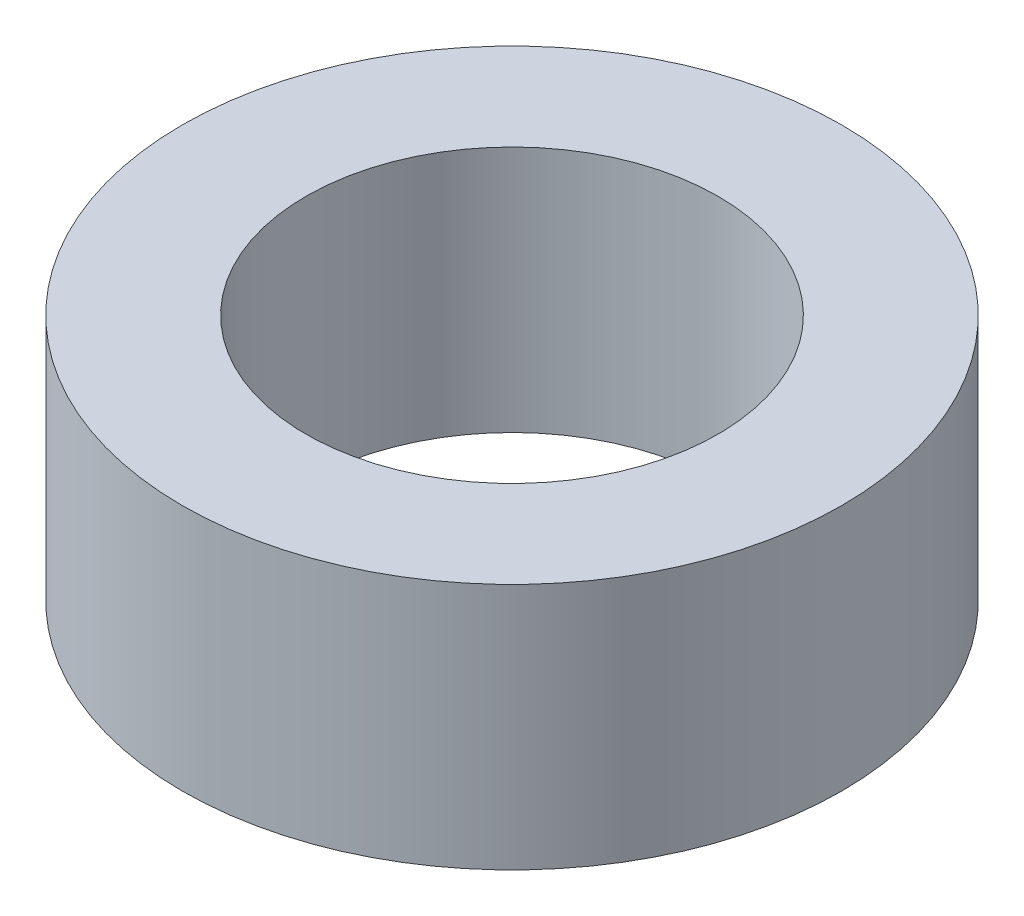
ISO-10303-21;
HEADER;
FILE_DESCRIPTION(('STEP AP214'),'2;1');
FILE_NAME('part.step','',(''),(''),'','','');
FILE_SCHEMA(('AUTOMOTIVE_DESIGN { 1 0 10303 214 1 1 1 1 }'));
ENDSEC;
DATA;
#1=APPLICATION_CONTEXT('core data for automotive mechanical design processes');
#2=APPLICATION_PROTOCOL_DEFINITION('international standard','automotive_design',2000,#1);
#3=PRODUCT_CONTEXT('',#1,'mechanical');
#4=PRODUCT('Part','Part','',(#3));
#5=PRODUCT_RELATED_PRODUCT_CATEGORY('part','',(#4));
#6=PRODUCT_DEFINITION_FORMATION('','',#4);
#7=PRODUCT_DEFINITION_CONTEXT('part definition',#1,'design');
#8=PRODUCT_DEFINITION('design','',#6,#7);
#9=PRODUCT_DEFINITION_SHAPE('','',#8);
#10=(LENGTH_UNIT() NAMED_UNIT(*) SI_UNIT(.MILLI.,.METRE.));
#11=(NAMED_UNIT(*) PLANE_ANGLE_UNIT() SI_UNIT($,.RADIAN.));
#12=(NAMED_UNIT(*) SI_UNIT($,.STERADIAN.) SOLID_ANGLE_UNIT());
#13=UNCERTAINTY_MEASURE_WITH_UNIT(LENGTH_MEASURE(1.E-05),#10,'distance_accuracy_value','');
#14=(GEOMETRIC_REPRESENTATION_CONTEXT(3) GLOBAL_UNCERTAINTY_ASSIGNED_CONTEXT((#13)) GLOBAL_UNIT_ASSIGNED_CONTEXT((#10,
#11,#12)) REPRESENTATION_CONTEXT('',''));
#15=CARTESIAN_POINT('',(0.,0.,0.));
#16=DIRECTION('',(0.,0.,1.));
#17=DIRECTION('',(1.,0.,0.));
#18=AXIS2_PLACEMENT_3D('',#15,#16,#17);
#19=CARTESIAN_POINT('',(0.,9.525,0.));
#20=DIRECTION('',(0.,1.,0.));
#21=DIRECTION('',(0.,0.,1.));
#22=AXIS2_PLACEMENT_3D('',#19,#20,#21);
#23=PLANE('',#22);
#24=CARTESIAN_POINT('',(0.,9.525,0.));
#25=DIRECTION('',(0.,1.,0.));
#26=DIRECTION('',(0.,0.,1.));
#27=AXIS2_PLACEMENT_3D('',#24,#25,#26);
#28=CIRCLE('',#27,12.7);
#29=CARTESIAN_POINT('',(0.,9.525,-12.7));
#30=VERTEX_POINT('',#29);
#31=EDGE_CURVE('E12',#30,#30,#28,.T.);
#32=ORIENTED_EDGE('',*,*,#31,.T.);
#33=EDGE_LOOP('',(#32));
#34=FACE_BOUND('',#33,.T.);
#35=CARTESIAN_POINT('',(0.,9.525,0.));
#36=DIRECTION('',(0.,1.,0.));
#37=DIRECTION('',(0.,0.,1.));
#38=AXIS2_PLACEMENT_3D('',#35,#36,#37);
#39=CIRCLE('',#38,7.9375);
#40=CARTESIAN_POINT('',(0.,9.525,-7.9375));
#41=VERTEX_POINT('',#40);
#42=EDGE_CURVE('E53',#41,#41,#39,.T.);
#43=ORIENTED_EDGE('',*,*,#42,.F.);
#44=EDGE_LOOP('',(#43));
#45=FACE_BOUND('',#44,.T.);
#46=ADVANCED_FACE('F42',(#34,#45),#23,.T.);
#47=CARTESIAN_POINT('',(0.,0.,0.));
#48=DIRECTION('',(0.,1.,0.));
#49=DIRECTION('',(0.,0.,1.));
#50=AXIS2_PLACEMENT_3D('',#47,#48,#49);
#51=PLANE('',#50);
#52=CARTESIAN_POINT('',(0.,0.,0.));
#53=DIRECTION('',(0.,1.,0.));
#54=DIRECTION('',(0.,0.,1.));
#55=AXIS2_PLACEMENT_3D('',#52,#53,#54);
#56=CIRCLE('',#55,12.7);
#57=CARTESIAN_POINT('',(0.,0.,-12.7));
#58=VERTEX_POINT('',#57);
#59=EDGE_CURVE('E46',#58,#58,#56,.T.);
#60=ORIENTED_EDGE('',*,*,#59,.F.);
#61=EDGE_LOOP('',(#60));
#62=FACE_BOUND('',#61,.T.);
#63=CARTESIAN_POINT('',(0.,0.,0.));
#64=DIRECTION('',(0.,1.,0.));
#65=DIRECTION('',(0.,0.,1.));
#66=AXIS2_PLACEMENT_3D('',#63,#64,#65);
#67=CIRCLE('',#66,7.9375);
#68=CARTESIAN_POINT('',(0.,0.,-7.9375));
#69=VERTEX_POINT('',#68);
#70=EDGE_CURVE('E55',#69,#69,#67,.T.);
#71=ORIENTED_EDGE('',*,*,#70,.T.);
#72=EDGE_LOOP('',(#71));
#73=FACE_BOUND('',#72,.T.);
#74=ADVANCED_FACE('F65',(#62,#73),#51,.F.);
#75=CARTESIAN_POINT('',(0.,9.525,0.));
#76=DIRECTION('',(0.,-1.,0.));
#77=DIRECTION('',(0.,0.,-1.));
#78=AXIS2_PLACEMENT_3D('',#75,#76,#77);
#79=CYLINDRICAL_SURFACE('',#78,12.7);
#80=CARTESIAN_POINT('',(0.,9.525,-12.7));
#81=CARTESIAN_POINT('',(0.,9.42578125,-12.7));
#82=CARTESIAN_POINT('',(0.,9.3265625,-12.7));
#83=CARTESIAN_POINT('',(0.,9.128125,-12.7));
#84=CARTESIAN_POINT('',(0.,9.02890625,-12.7));
#85=CARTESIAN_POINT('',(0.,8.83046875,-12.7));
#86=CARTESIAN_POINT('',(0.,8.73125,-12.7));
#87=CARTESIAN_POINT('',(0.,8.5328125,-12.7));
#88=CARTESIAN_POINT('',(0.,8.43359375,-12.7));
#89=CARTESIAN_POINT('',(0.,8.23515625,-12.7));
#90=CARTESIAN_POINT('',(0.,8.1359375,-12.7));
#91=CARTESIAN_POINT('',(0.,7.9375,-12.7));
#92=CARTESIAN_POINT('',(0.,7.83828125,-12.7));
#93=CARTESIAN_POINT('',(0.,7.63984375,-12.7));
#94=CARTESIAN_POINT('',(0.,7.540625,-12.7));
#95=CARTESIAN_POINT('',(0.,7.3421875,-12.7));
#96=CARTESIAN_POINT('',(0.,7.24296875,-12.7));
#97=CARTESIAN_POINT('',(0.,7.04453125,-12.7));
#98=CARTESIAN_POINT('',(0.,6.9453125,-12.7));
#99=CARTESIAN_POINT('',(0.,6.746875,-12.7));
#100=CARTESIAN_POINT('',(0.,6.64765625,-12.7));
#101=CARTESIAN_POINT('',(0.,6.44921875,-12.7));
#102=CARTESIAN_POINT('',(0.,6.35,-12.7));
#103=CARTESIAN_POINT('',(0.,6.1515625,-12.7));
#104=CARTESIAN_POINT('',(0.,6.05234375,-12.7));
#105=CARTESIAN_POINT('',(0.,5.85390625,-12.7));
#106=CARTESIAN_POINT('',(0.,5.7546875,-12.7));
#107=CARTESIAN_POINT('',(0.,5.55625,-12.7));
#108=CARTESIAN_POINT('',(0.,5.45703125,-12.7));
#109=CARTESIAN_POINT('',(0.,5.25859375,-12.7));
#110=CARTESIAN_POINT('',(0.,5.159375,-12.7));
#111=CARTESIAN_POINT('',(0.,4.9609375,-12.7));
#112=CARTESIAN_POINT('',(0.,4.86171875,-12.7));
#113=CARTESIAN_POINT('',(0.,4.66328125,-12.7));
#114=CARTESIAN_POINT('',(0.,4.5640625,-12.7));
#115=CARTESIAN_POINT('',(0.,4.365625,-12.7));
#116=CARTESIAN_POINT('',(0.,4.26640625,-12.7));
#117=CARTESIAN_POINT('',(0.,4.06796875,-12.7));
#118=CARTESIAN_POINT('',(0.,3.96875,-12.7));
#119=CARTESIAN_POINT('',(0.,3.7703125,-12.7));
#120=CARTESIAN_POINT('',(0.,3.67109375,-12.7));
#121=CARTESIAN_POINT('',(0.,3.47265625,-12.7));
#122=CARTESIAN_POINT('',(0.,3.3734375,-12.7));
#123=CARTESIAN_POINT('',(0.,3.175,-12.7));
#124=CARTESIAN_POINT('',(0.,3.07578125,-12.7));
#125=CARTESIAN_POINT('',(0.,2.87734375,-12.7));
#126=CARTESIAN_POINT('',(0.,2.778125,-12.7));
#127=CARTESIAN_POINT('',(0.,2.5796875,-12.7));
#128=CARTESIAN_POINT('',(0.,2.48046875,-12.7));
#129=CARTESIAN_POINT('',(0.,2.28203125,-12.7));
#130=CARTESIAN_POINT('',(0.,2.1828125,-12.7));
#131=CARTESIAN_POINT('',(0.,1.984375,-12.7));
#132=CARTESIAN_POINT('',(0.,1.88515625,-12.7));
#133=CARTESIAN_POINT('',(0.,1.68671875,-12.7));
#134=CARTESIAN_POINT('',(0.,1.5875,-12.7));
#135=CARTESIAN_POINT('',(0.,1.3890625,-12.7));
#136=CARTESIAN_POINT('',(0.,1.28984375,-12.7));
#137=CARTESIAN_POINT('',(0.,1.09140625,-12.7));
#138=CARTESIAN_POINT('',(0.,0.992187500000001,-12.7));
#139=CARTESIAN_POINT('',(0.,0.793750000000001,-12.7));
#140=CARTESIAN_POINT('',(0.,0.69453125,-12.7));
#141=CARTESIAN_POINT('',(0.,0.49609375,-12.7));
#142=CARTESIAN_POINT('',(0.,0.396875,-12.7));
#143=CARTESIAN_POINT('',(0.,0.1984375,-12.7));
#144=CARTESIAN_POINT('',(0.,0.0992187500000001,-12.7));
#145=CARTESIAN_POINT('',(0.,0.,-12.7));
#146=B_SPLINE_CURVE_WITH_KNOTS('',3,(#80,#81,#82,#83,#84,#85,#86,#87,#88,#89,#90,#91,#92,#93,
#94,#95,#96,#97,#98,#99,#100,#101,#102,#103,#104,#105,#106,#107,#108,#109,#110,#111,#112,#113,
#114,#115,#116,#117,#118,#119,#120,#121,#122,#123,#124,#125,#126,#127,#128,#129,#130,#131,#132,
#133,#134,#135,#136,#137,#138,#139,#140,#141,#142,#143,#144,#145),.UNSPECIFIED.,.F.,.F.,(4,2,2,
2,2,2,2,2,2,2,2,2,2,2,2,2,2,2,2,2,2,2,2,2,2,2,2,2,2,2,2,2,4),(0.,0.29765625,0.5953125,
0.892968750000001,1.190625,1.48828125,1.7859375,2.08359375,2.38125,2.67890625,2.9765625,
3.27421875,3.571875,3.86953125,4.1671875,4.46484375,4.7625,5.06015625,5.3578125,5.65546875,
5.953125,6.25078125,6.5484375,6.84609375,7.14375,7.44140625,7.7390625,8.03671875,8.334375,
8.63203125,8.9296875,9.22734375,9.525),.UNSPECIFIED.);
#147=EDGE_CURVE('BSEAM44',#30,#58,#146,.T.);
#148=ORIENTED_EDGE('',*,*,#31,.F.);
#149=ORIENTED_EDGE('',*,*,#59,.T.);
#150=ORIENTED_EDGE('',*,*,#147,.T.);
#151=ORIENTED_EDGE('',*,*,#147,.F.);
#152=EDGE_LOOP('',(#148,#150,#149,#151));
#153=FACE_BOUND('',#152,.T.);
#154=ADVANCED_FACE('F44',(#153),#79,.T.);
#155=CARTESIAN_POINT('',(0.,9.525,0.));
#156=DIRECTION('',(0.,-1.,0.));
#157=DIRECTION('',(0.,0.,-1.));
#158=AXIS2_PLACEMENT_3D('',#155,#156,#157);
#159=CYLINDRICAL_SURFACE('',#158,7.9375);
#160=CARTESIAN_POINT('',(0.,9.525,-7.9375));
#161=CARTESIAN_POINT('',(0.,9.42578125,-7.9375));
#162=CARTESIAN_POINT('',(0.,9.3265625,-7.9375));
#163=CARTESIAN_POINT('',(0.,9.128125,-7.9375));
#164=CARTESIAN_POINT('',(0.,9.02890625,-7.9375));
#165=CARTESIAN_POINT('',(0.,8.83046875,-7.9375));
#166=CARTESIAN_POINT('',(0.,8.73125,-7.9375));
#167=CARTESIAN_POINT('',(0.,8.5328125,-7.9375));
#168=CARTESIAN_POINT('',(0.,8.43359375,-7.9375));
#169=CARTESIAN_POINT('',(0.,8.23515625,-7.9375));
#170=CARTESIAN_POINT('',(0.,8.1359375,-7.9375));
#171=CARTESIAN_POINT('',(0.,7.9375,-7.9375));
#172=CARTESIAN_POINT('',(0.,7.83828125,-7.9375));
#173=CARTESIAN_POINT('',(0.,7.63984375,-7.9375));
#174=CARTESIAN_POINT('',(0.,7.540625,-7.9375));
#175=CARTESIAN_POINT('',(0.,7.3421875,-7.9375));
#176=CARTESIAN_POINT('',(0.,7.24296875,-7.9375));
#177=CARTESIAN_POINT('',(0.,7.04453125,-7.9375));
#178=CARTESIAN_POINT('',(0.,6.9453125,-7.9375));
#179=CARTESIAN_POINT('',(0.,6.746875,-7.9375));
#180=CARTESIAN_POINT('',(0.,6.64765625,-7.9375));
#181=CARTESIAN_POINT('',(0.,6.44921875,-7.9375));
#182=CARTESIAN_POINT('',(0.,6.35,-7.9375));
#183=CARTESIAN_POINT('',(0.,6.1515625,-7.9375));
#184=CARTESIAN_POINT('',(0.,6.05234375,-7.9375));
#185=CARTESIAN_POINT('',(0.,5.85390625,-7.9375));
#186=CARTESIAN_POINT('',(0.,5.7546875,-7.9375));
#187=CARTESIAN_POINT('',(0.,5.55625,-7.9375));
#188=CARTESIAN_POINT('',(0.,5.45703125,-7.9375));
#189=CARTESIAN_POINT('',(0.,5.25859375,-7.9375));
#190=CARTESIAN_POINT('',(0.,5.159375,-7.9375));
#191=CARTESIAN_POINT('',(0.,4.9609375,-7.9375));
#192=CARTESIAN_POINT('',(0.,4.86171875,-7.9375));
#193=CARTESIAN_POINT('',(0.,4.66328125,-7.9375));
#194=CARTESIAN_POINT('',(0.,4.5640625,-7.9375));
#195=CARTESIAN_POINT('',(0.,4.365625,-7.9375));
#196=CARTESIAN_POINT('',(0.,4.26640625,-7.9375));
#197=CARTESIAN_POINT('',(0.,4.06796875,-7.9375));
#198=CARTESIAN_POINT('',(0.,3.96875,-7.9375));
#199=CARTESIAN_POINT('',(0.,3.7703125,-7.9375));
#200=CARTESIAN_POINT('',(0.,3.67109375,-7.9375));
#201=CARTESIAN_POINT('',(0.,3.47265625,-7.9375));
#202=CARTESIAN_POINT('',(0.,3.3734375,-7.9375));
#203=CARTESIAN_POINT('',(0.,3.175,-7.9375));
#204=CARTESIAN_POINT('',(0.,3.07578125,-7.9375));
#205=CARTESIAN_POINT('',(0.,2.87734375,-7.9375));
#206=CARTESIAN_POINT('',(0.,2.778125,-7.9375));
#207=CARTESIAN_POINT('',(0.,2.5796875,-7.9375));
#208=CARTESIAN_POINT('',(0.,2.48046875,-7.9375));
#209=CARTESIAN_POINT('',(0.,2.28203125,-7.9375));
#210=CARTESIAN_POINT('',(0.,2.1828125,-7.9375));
#211=CARTESIAN_POINT('',(0.,1.984375,-7.9375));
#212=CARTESIAN_POINT('',(0.,1.88515625,-7.9375));
#213=CARTESIAN_POINT('',(0.,1.68671875,-7.9375));
#214=CARTESIAN_POINT('',(0.,1.5875,-7.9375));
#215=CARTESIAN_POINT('',(0.,1.3890625,-7.9375));
#216=CARTESIAN_POINT('',(0.,1.28984375,-7.9375));
#217=CARTESIAN_POINT('',(0.,1.09140625,-7.9375));
#218=CARTESIAN_POINT('',(0.,0.992187500000001,-7.9375));
#219=CARTESIAN_POINT('',(0.,0.793750000000001,-7.9375));
#220=CARTESIAN_POINT('',(0.,0.69453125,-7.9375));
#221=CARTESIAN_POINT('',(0.,0.49609375,-7.9375));
#222=CARTESIAN_POINT('',(0.,0.396875,-7.9375));
#223=CARTESIAN_POINT('',(0.,0.1984375,-7.9375));
#224=CARTESIAN_POINT('',(0.,0.0992187500000001,-7.9375));
#225=CARTESIAN_POINT('',(0.,0.,-7.9375));
#226=B_SPLINE_CURVE_WITH_KNOTS('',3,(#160,#161,#162,#163,#164,#165,#166,#167,#168,#169,#170,
#171,#172,#173,#174,#175,#176,#177,#178,#179,#180,#181,#182,#183,#184,#185,#186,#187,#188,#189,
#190,#191,#192,#193,#194,#195,#196,#197,#198,#199,#200,#201,#202,#203,#204,#205,#206,#207,#208,
#209,#210,#211,#212,#213,#214,#215,#216,#217,#218,#219,#220,#221,#222,#223,#224,#225),
.UNSPECIFIED.,.F.,.F.,(4,2,2,2,2,2,2,2,2,2,2,2,2,2,2,2,2,2,2,2,2,2,2,2,2,2,2,2,2,2,2,2,4),(0.,
0.297656249999998,0.595312499999999,0.892968749999999,1.190625,1.48828125,1.7859375,2.08359375,
2.38125,2.67890625,2.9765625,3.27421875,3.571875,3.86953125,4.1671875,4.46484375,4.7625,
5.06015625,5.3578125,5.65546875,5.953125,6.25078125,6.5484375,6.84609375,7.14375,7.44140625,
7.7390625,8.03671875,8.334375,8.63203125,8.9296875,9.22734375,9.525),.UNSPECIFIED.);
#227=EDGE_CURVE('BSEAM61',#41,#69,#226,.T.);
#228=ORIENTED_EDGE('',*,*,#42,.T.);
#229=ORIENTED_EDGE('',*,*,#70,.F.);
#230=ORIENTED_EDGE('',*,*,#227,.T.);
#231=ORIENTED_EDGE('',*,*,#227,.F.);
#232=EDGE_LOOP('',(#228,#230,#229,#231));
#233=FACE_BOUND('',#232,.T.);
#234=ADVANCED_FACE('F61',(#233),#159,.F.);
#235=CLOSED_SHELL('',(#46,#74,#154,#234));
#236=MANIFOLD_SOLID_BREP('B2',#235);
#237=ADVANCED_BREP_SHAPE_REPRESENTATION('',(#18,#236),#14);
#238=SHAPE_DEFINITION_REPRESENTATION(#9,#237);
ENDSEC;
END-ISO-10303-21;
